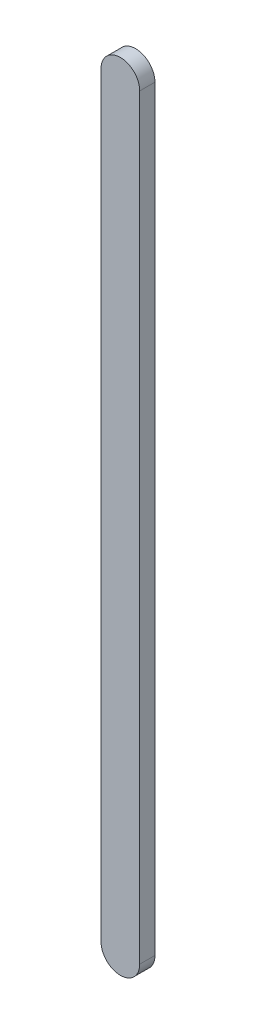
ISO-10303-21;
HEADER;
FILE_DESCRIPTION(('STEP AP214'),'2;1');
FILE_NAME('part.step','',(''),(''),'','','');
FILE_SCHEMA(('AUTOMOTIVE_DESIGN { 1 0 10303 214 1 1 1 1 }'));
ENDSEC;
DATA;
#1=APPLICATION_CONTEXT('core data for automotive mechanical design processes');
#2=APPLICATION_PROTOCOL_DEFINITION('international standard','automotive_design',2000,#1);
#3=PRODUCT_CONTEXT('',#1,'mechanical');
#4=PRODUCT('Part','Part','',(#3));
#5=PRODUCT_RELATED_PRODUCT_CATEGORY('part','',(#4));
#6=PRODUCT_DEFINITION_FORMATION('','',#4);
#7=PRODUCT_DEFINITION_CONTEXT('part definition',#1,'design');
#8=PRODUCT_DEFINITION('design','',#6,#7);
#9=PRODUCT_DEFINITION_SHAPE('','',#8);
#10=(LENGTH_UNIT() NAMED_UNIT(*) SI_UNIT(.MILLI.,.METRE.));
#11=(NAMED_UNIT(*) PLANE_ANGLE_UNIT() SI_UNIT($,.RADIAN.));
#12=(NAMED_UNIT(*) SI_UNIT($,.STERADIAN.) SOLID_ANGLE_UNIT());
#13=UNCERTAINTY_MEASURE_WITH_UNIT(LENGTH_MEASURE(1.E-05),#10,'distance_accuracy_value','');
#14=(GEOMETRIC_REPRESENTATION_CONTEXT(3) GLOBAL_UNCERTAINTY_ASSIGNED_CONTEXT((#13)) GLOBAL_UNIT_ASSIGNED_CONTEXT((#10,
#11,#12)) REPRESENTATION_CONTEXT('',''));
#15=CARTESIAN_POINT('',(0.,0.,0.));
#16=DIRECTION('',(0.,0.,1.));
#17=DIRECTION('',(1.,0.,0.));
#18=AXIS2_PLACEMENT_3D('',#15,#16,#17);
#19=CARTESIAN_POINT('',(151.384,62.914784,0.));
#20=DIRECTION('',(-1.,0.,0.));
#21=DIRECTION('',(0.,1.,0.));
#22=AXIS2_PLACEMENT_3D('',#19,#20,#21);
#23=PLANE('',#22);
#24=DIRECTION('',(0.,1.,0.));
#25=VECTOR('',#24,1.);
#26=CARTESIAN_POINT('',(151.384,62.914784,0.1999996));
#27=LINE('',#26,#25);
#28=CARTESIAN_POINT('',(151.384,62.914784,0.1999996));
#29=VERTEX_POINT('',#28);
#30=CARTESIAN_POINT('',(151.384,72.8472,0.1999996));
#31=VERTEX_POINT('',#30);
#32=EDGE_CURVE('E11',#29,#31,#27,.T.);
#33=ORIENTED_EDGE('',*,*,#32,.F.);
#34=DIRECTION('',(0.,0.,1.));
#35=VECTOR('',#34,1.);
#36=CARTESIAN_POINT('',(151.384,62.914784,0.));
#37=LINE('',#36,#35);
#38=CARTESIAN_POINT('',(151.384,62.914784,0.));
#39=VERTEX_POINT('',#38);
#40=EDGE_CURVE('E24',#39,#29,#37,.T.);
#41=ORIENTED_EDGE('',*,*,#40,.F.);
#42=DIRECTION('',(0.,1.,0.));
#43=VECTOR('',#42,1.);
#44=CARTESIAN_POINT('',(151.384,62.914784,0.));
#45=LINE('',#44,#43);
#46=CARTESIAN_POINT('',(151.384,72.8472,0.));
#47=VERTEX_POINT('',#46);
#48=EDGE_CURVE('E75',#39,#47,#45,.T.);
#49=ORIENTED_EDGE('',*,*,#48,.T.);
#50=DIRECTION('',(0.,0.,1.));
#51=VECTOR('',#50,1.);
#52=CARTESIAN_POINT('',(151.384,72.8472,0.));
#53=LINE('',#52,#51);
#54=EDGE_CURVE('E37',#47,#31,#53,.T.);
#55=ORIENTED_EDGE('',*,*,#54,.T.);
#56=EDGE_LOOP('',(#33,#41,#49,#55));
#57=FACE_BOUND('',#56,.T.);
#58=ADVANCED_FACE('F17',(#57),#23,.F.);
#59=CARTESIAN_POINT('',(151.13,72.8472,0.));
#60=DIRECTION('',(0.,0.,-1.));
#61=DIRECTION('',(1.,0.,0.));
#62=AXIS2_PLACEMENT_3D('',#59,#60,#61);
#63=CYLINDRICAL_SURFACE('',#62,0.254);
#64=CARTESIAN_POINT('',(151.13,72.8472,0.1999996));
#65=DIRECTION('',(0.,0.,1.));
#66=DIRECTION('',(1.,0.,0.));
#67=AXIS2_PLACEMENT_3D('',#64,#65,#66);
#68=CIRCLE('',#67,0.254);
#69=CARTESIAN_POINT('',(150.876,72.8472,0.1999996));
#70=VERTEX_POINT('',#69);
#71=EDGE_CURVE('E83',#31,#70,#68,.T.);
#72=ORIENTED_EDGE('',*,*,#71,.F.);
#73=ORIENTED_EDGE('',*,*,#54,.F.);
#74=CARTESIAN_POINT('',(151.13,72.8472,0.));
#75=DIRECTION('',(0.,0.,1.));
#76=DIRECTION('',(1.,0.,0.));
#77=AXIS2_PLACEMENT_3D('',#74,#75,#76);
#78=CIRCLE('',#77,0.254);
#79=CARTESIAN_POINT('',(150.876,72.8472,0.));
#80=VERTEX_POINT('',#79);
#81=EDGE_CURVE('E81',#47,#80,#78,.T.);
#82=ORIENTED_EDGE('',*,*,#81,.T.);
#83=DIRECTION('',(0.,0.,1.));
#84=VECTOR('',#83,1.);
#85=CARTESIAN_POINT('',(150.876,72.8472,0.));
#86=LINE('',#85,#84);
#87=EDGE_CURVE('E67',#80,#70,#86,.T.);
#88=ORIENTED_EDGE('',*,*,#87,.T.);
#89=EDGE_LOOP('',(#72,#73,#82,#88));
#90=FACE_BOUND('',#89,.T.);
#91=ADVANCED_FACE('F89',(#90),#63,.T.);
#92=CARTESIAN_POINT('',(150.876,72.8472,0.));
#93=DIRECTION('',(1.,0.,0.));
#94=DIRECTION('',(0.,-1.,0.));
#95=AXIS2_PLACEMENT_3D('',#92,#93,#94);
#96=PLANE('',#95);
#97=DIRECTION('',(0.,-1.,0.));
#98=VECTOR('',#97,1.);
#99=CARTESIAN_POINT('',(150.876,72.8472,0.1999996));
#100=LINE('',#99,#98);
#101=CARTESIAN_POINT('',(150.876,62.914784,0.1999996));
#102=VERTEX_POINT('',#101);
#103=EDGE_CURVE('E71',#70,#102,#100,.T.);
#104=ORIENTED_EDGE('',*,*,#103,.F.);
#105=ORIENTED_EDGE('',*,*,#87,.F.);
#106=DIRECTION('',(0.,-1.,0.));
#107=VECTOR('',#106,1.);
#108=CARTESIAN_POINT('',(150.876,72.8472,0.));
#109=LINE('',#108,#107);
#110=CARTESIAN_POINT('',(150.876,62.914784,0.));
#111=VERTEX_POINT('',#110);
#112=EDGE_CURVE('E63',#80,#111,#109,.T.);
#113=ORIENTED_EDGE('',*,*,#112,.T.);
#114=DIRECTION('',(0.,0.,1.));
#115=VECTOR('',#114,1.);
#116=CARTESIAN_POINT('',(150.876,62.914784,0.));
#117=LINE('',#116,#115);
#118=EDGE_CURVE('E53',#111,#102,#117,.T.);
#119=ORIENTED_EDGE('',*,*,#118,.T.);
#120=EDGE_LOOP('',(#104,#105,#113,#119));
#121=FACE_BOUND('',#120,.T.);
#122=ADVANCED_FACE('F66',(#121),#96,.F.);
#123=CARTESIAN_POINT('',(151.13,62.914784,0.));
#124=DIRECTION('',(0.,0.,-1.));
#125=DIRECTION('',(-1.,0.,0.));
#126=AXIS2_PLACEMENT_3D('',#123,#124,#125);
#127=CYLINDRICAL_SURFACE('',#126,0.253999999999998);
#128=CARTESIAN_POINT('',(151.13,62.914784,0.1999996));
#129=DIRECTION('',(0.,0.,1.));
#130=DIRECTION('',(-1.,0.,0.));
#131=AXIS2_PLACEMENT_3D('',#128,#129,#130);
#132=CIRCLE('',#131,0.253999999999998);
#133=EDGE_CURVE('E59',#102,#29,#132,.T.);
#134=ORIENTED_EDGE('',*,*,#133,.F.);
#135=ORIENTED_EDGE('',*,*,#118,.F.);
#136=CARTESIAN_POINT('',(151.13,62.914784,0.));
#137=DIRECTION('',(0.,0.,1.));
#138=DIRECTION('',(-1.,0.,0.));
#139=AXIS2_PLACEMENT_3D('',#136,#137,#138);
#140=CIRCLE('',#139,0.253999999999998);
#141=EDGE_CURVE('E57',#111,#39,#140,.T.);
#142=ORIENTED_EDGE('',*,*,#141,.T.);
#143=ORIENTED_EDGE('',*,*,#40,.T.);
#144=EDGE_LOOP('',(#134,#135,#142,#143));
#145=FACE_BOUND('',#144,.T.);
#146=ADVANCED_FACE('F55',(#145),#127,.T.);
#147=CARTESIAN_POINT('',(151.384,62.914784,0.));
#148=DIRECTION('',(0.,0.,-1.));
#149=DIRECTION('',(-1.,0.,0.));
#150=AXIS2_PLACEMENT_3D('',#147,#148,#149);
#151=PLANE('',#150);
#152=ORIENTED_EDGE('',*,*,#141,.F.);
#153=ORIENTED_EDGE('',*,*,#112,.F.);
#154=ORIENTED_EDGE('',*,*,#81,.F.);
#155=ORIENTED_EDGE('',*,*,#48,.F.);
#156=EDGE_LOOP('',(#152,#153,#154,#155));
#157=FACE_BOUND('',#156,.T.);
#158=ADVANCED_FACE('F74',(#157),#151,.T.);
#159=CARTESIAN_POINT('',(151.384,62.914784,0.1999996));
#160=DIRECTION('',(0.,0.,-1.));
#161=DIRECTION('',(-1.,0.,0.));
#162=AXIS2_PLACEMENT_3D('',#159,#160,#161);
#163=PLANE('',#162);
#164=ORIENTED_EDGE('',*,*,#32,.T.);
#165=ORIENTED_EDGE('',*,*,#71,.T.);
#166=ORIENTED_EDGE('',*,*,#103,.T.);
#167=ORIENTED_EDGE('',*,*,#133,.T.);
#168=EDGE_LOOP('',(#164,#165,#166,#167));
#169=FACE_BOUND('',#168,.T.);
#170=ADVANCED_FACE('F91',(#169),#163,.F.);
#171=CLOSED_SHELL('',(#58,#91,#122,#146,#158,#170));
#172=MANIFOLD_SOLID_BREP('B1',#171);
#173=ADVANCED_BREP_SHAPE_REPRESENTATION('',(#18,#172),#14);
#174=SHAPE_DEFINITION_REPRESENTATION(#9,#173);
ENDSEC;
END-ISO-10303-21;
